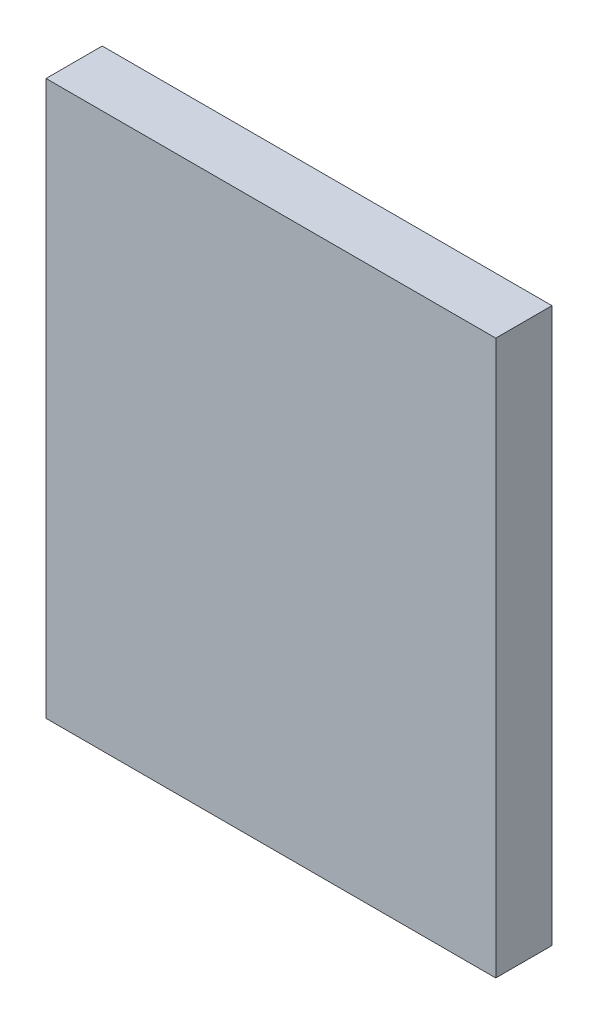
ISO-10303-21;
HEADER;
FILE_DESCRIPTION(('STEP AP214'),'2;1');
FILE_NAME('part.step','',(''),(''),'','','');
FILE_SCHEMA(('AUTOMOTIVE_DESIGN { 1 0 10303 214 1 1 1 1 }'));
ENDSEC;
DATA;
#1=APPLICATION_CONTEXT('core data for automotive mechanical design processes');
#2=APPLICATION_PROTOCOL_DEFINITION('international standard','automotive_design',2000,#1);
#3=PRODUCT_CONTEXT('',#1,'mechanical');
#4=PRODUCT('Part','Part','',(#3));
#5=PRODUCT_RELATED_PRODUCT_CATEGORY('part','',(#4));
#6=PRODUCT_DEFINITION_FORMATION('','',#4);
#7=PRODUCT_DEFINITION_CONTEXT('part definition',#1,'design');
#8=PRODUCT_DEFINITION('design','',#6,#7);
#9=PRODUCT_DEFINITION_SHAPE('','',#8);
#10=(LENGTH_UNIT() NAMED_UNIT(*) SI_UNIT(.MILLI.,.METRE.));
#11=(NAMED_UNIT(*) PLANE_ANGLE_UNIT() SI_UNIT($,.RADIAN.));
#12=(NAMED_UNIT(*) SI_UNIT($,.STERADIAN.) SOLID_ANGLE_UNIT());
#13=UNCERTAINTY_MEASURE_WITH_UNIT(LENGTH_MEASURE(1.E-05),#10,'distance_accuracy_value','');
#14=(GEOMETRIC_REPRESENTATION_CONTEXT(3) GLOBAL_UNCERTAINTY_ASSIGNED_CONTEXT((#13)) GLOBAL_UNIT_ASSIGNED_CONTEXT((#10,
#11,#12)) REPRESENTATION_CONTEXT('',''));
#15=CARTESIAN_POINT('',(0.,0.,0.));
#16=DIRECTION('',(0.,0.,1.));
#17=DIRECTION('',(1.,0.,0.));
#18=AXIS2_PLACEMENT_3D('',#15,#16,#17);
#19=CARTESIAN_POINT('',(7.93749999999919,-54.8106496320324,3.175));
#20=DIRECTION('',(1.09738333905494E-12,1.,0.));
#21=DIRECTION('',(-1.,1.09738333905494E-12,0.));
#22=AXIS2_PLACEMENT_3D('',#19,#20,#21);
#23=PLANE('',#22);
#24=DIRECTION('',(1.,-1.09738333905494E-12,0.));
#25=VECTOR('',#24,1.);
#26=CARTESIAN_POINT('',(7.93749999999919,-54.8106496320324,0.));
#27=LINE('',#26,#25);
#28=CARTESIAN_POINT('',(-17.4625000000007,-54.8106496320045,0.));
#29=VERTEX_POINT('',#28);
#30=CARTESIAN_POINT('',(7.93749999999919,-54.8106496320324,0.));
#31=VERTEX_POINT('',#30);
#32=EDGE_CURVE('E102',#29,#31,#27,.T.);
#33=ORIENTED_EDGE('',*,*,#32,.T.);
#34=DIRECTION('',(0.,0.,-1.));
#35=VECTOR('',#34,1.);
#36=CARTESIAN_POINT('',(7.93749999999919,-54.8106496320324,3.175));
#37=LINE('',#36,#35);
#38=CARTESIAN_POINT('',(7.93749999999919,-54.8106496320324,3.175));
#39=VERTEX_POINT('',#38);
#40=EDGE_CURVE('E11',#39,#31,#37,.T.);
#41=ORIENTED_EDGE('',*,*,#40,.F.);
#42=DIRECTION('',(1.,-1.09738333905494E-12,0.));
#43=VECTOR('',#42,1.);
#44=CARTESIAN_POINT('',(7.93749999999919,-54.8106496320324,3.175));
#45=LINE('',#44,#43);
#46=CARTESIAN_POINT('',(-17.4625000000007,-54.8106496320045,3.175));
#47=VERTEX_POINT('',#46);
#48=EDGE_CURVE('E90',#47,#39,#45,.T.);
#49=ORIENTED_EDGE('',*,*,#48,.F.);
#50=DIRECTION('',(0.,0.,-1.));
#51=VECTOR('',#50,1.);
#52=CARTESIAN_POINT('',(-17.4625000000007,-54.8106496320045,3.175));
#53=LINE('',#52,#51);
#54=EDGE_CURVE('E98',#47,#29,#53,.T.);
#55=ORIENTED_EDGE('',*,*,#54,.T.);
#56=EDGE_LOOP('',(#33,#41,#49,#55));
#57=FACE_BOUND('',#56,.T.);
#58=ADVANCED_FACE('F39',(#57),#23,.F.);
#59=CARTESIAN_POINT('',(7.93749999999919,-23.5124221673556,3.175));
#60=DIRECTION('',(-1.,0.,0.));
#61=DIRECTION('',(0.,0.,1.));
#62=AXIS2_PLACEMENT_3D('',#59,#60,#61);
#63=PLANE('',#62);
#64=DIRECTION('',(0.,1.,0.));
#65=VECTOR('',#64,1.);
#66=CARTESIAN_POINT('',(7.93749999999919,-23.5124221673556,0.));
#67=LINE('',#66,#65);
#68=CARTESIAN_POINT('',(7.93749999999919,-23.5124221673556,0.));
#69=VERTEX_POINT('',#68);
#70=EDGE_CURVE('E94',#31,#69,#67,.T.);
#71=ORIENTED_EDGE('',*,*,#70,.T.);
#72=DIRECTION('',(0.,0.,-1.));
#73=VECTOR('',#72,1.);
#74=CARTESIAN_POINT('',(7.93749999999919,-23.5124221673556,3.175));
#75=LINE('',#74,#73);
#76=CARTESIAN_POINT('',(7.93749999999919,-23.5124221673556,3.175));
#77=VERTEX_POINT('',#76);
#78=EDGE_CURVE('E47',#77,#69,#75,.T.);
#79=ORIENTED_EDGE('',*,*,#78,.F.);
#80=DIRECTION('',(0.,1.,0.));
#81=VECTOR('',#80,1.);
#82=CARTESIAN_POINT('',(7.93749999999919,-23.5124221673556,3.175));
#83=LINE('',#82,#81);
#84=EDGE_CURVE('E85',#39,#77,#83,.T.);
#85=ORIENTED_EDGE('',*,*,#84,.F.);
#86=ORIENTED_EDGE('',*,*,#40,.T.);
#87=EDGE_LOOP('',(#71,#79,#85,#86));
#88=FACE_BOUND('',#87,.T.);
#89=ADVANCED_FACE('F93',(#88),#63,.F.);
#90=CARTESIAN_POINT('',(7.93749999999919,-23.5124221673556,3.175));
#91=DIRECTION('',(0.,-1.,0.));
#92=DIRECTION('',(0.,0.,-1.));
#93=AXIS2_PLACEMENT_3D('',#90,#91,#92);
#94=PLANE('',#93);
#95=DIRECTION('',(-1.,0.,0.));
#96=VECTOR('',#95,1.);
#97=CARTESIAN_POINT('',(7.93749999999919,-23.5124221673556,0.));
#98=LINE('',#97,#96);
#99=CARTESIAN_POINT('',(-17.4625000000007,-23.5124221673556,0.));
#100=VERTEX_POINT('',#99);
#101=EDGE_CURVE('E72',#69,#100,#98,.T.);
#102=ORIENTED_EDGE('',*,*,#101,.T.);
#103=DIRECTION('',(0.,0.,-1.));
#104=VECTOR('',#103,1.);
#105=CARTESIAN_POINT('',(-17.4625000000007,-23.5124221673556,3.175));
#106=LINE('',#105,#104);
#107=CARTESIAN_POINT('',(-17.4625000000007,-23.5124221673556,3.175));
#108=VERTEX_POINT('',#107);
#109=EDGE_CURVE('E95',#108,#100,#106,.T.);
#110=ORIENTED_EDGE('',*,*,#109,.F.);
#111=DIRECTION('',(-1.,0.,0.));
#112=VECTOR('',#111,1.);
#113=CARTESIAN_POINT('',(7.93749999999919,-23.5124221673556,3.175));
#114=LINE('',#113,#112);
#115=EDGE_CURVE('E88',#77,#108,#114,.T.);
#116=ORIENTED_EDGE('',*,*,#115,.F.);
#117=ORIENTED_EDGE('',*,*,#78,.T.);
#118=EDGE_LOOP('',(#102,#110,#116,#117));
#119=FACE_BOUND('',#118,.T.);
#120=ADVANCED_FACE('F96',(#119),#94,.F.);
#121=CARTESIAN_POINT('',(-17.4625000000007,-23.5124221673556,3.175));
#122=DIRECTION('',(1.,0.,0.));
#123=DIRECTION('',(0.,0.,-1.));
#124=AXIS2_PLACEMENT_3D('',#121,#122,#123);
#125=PLANE('',#124);
#126=DIRECTION('',(0.,-1.,0.));
#127=VECTOR('',#126,1.);
#128=CARTESIAN_POINT('',(-17.4625000000007,-23.5124221673556,0.));
#129=LINE('',#128,#127);
#130=EDGE_CURVE('E78',#100,#29,#129,.T.);
#131=ORIENTED_EDGE('',*,*,#130,.T.);
#132=ORIENTED_EDGE('',*,*,#54,.F.);
#133=DIRECTION('',(0.,-1.,0.));
#134=VECTOR('',#133,1.);
#135=CARTESIAN_POINT('',(-17.4625000000007,-23.5124221673556,3.175));
#136=LINE('',#135,#134);
#137=EDGE_CURVE('E55',#108,#47,#136,.T.);
#138=ORIENTED_EDGE('',*,*,#137,.F.);
#139=ORIENTED_EDGE('',*,*,#109,.T.);
#140=EDGE_LOOP('',(#131,#132,#138,#139));
#141=FACE_BOUND('',#140,.T.);
#142=ADVANCED_FACE('F109',(#141),#125,.F.);
#143=CARTESIAN_POINT('',(0.,0.,3.175));
#144=DIRECTION('',(0.,0.,1.));
#145=DIRECTION('',(1.,0.,0.));
#146=AXIS2_PLACEMENT_3D('',#143,#144,#145);
#147=PLANE('',#146);
#148=ORIENTED_EDGE('',*,*,#48,.T.);
#149=ORIENTED_EDGE('',*,*,#84,.T.);
#150=ORIENTED_EDGE('',*,*,#115,.T.);
#151=ORIENTED_EDGE('',*,*,#137,.T.);
#152=EDGE_LOOP('',(#148,#149,#150,#151));
#153=FACE_BOUND('',#152,.T.);
#154=ADVANCED_FACE('F86',(#153),#147,.T.);
#155=CARTESIAN_POINT('',(0.,0.,0.));
#156=DIRECTION('',(0.,0.,1.));
#157=DIRECTION('',(1.,0.,0.));
#158=AXIS2_PLACEMENT_3D('',#155,#156,#157);
#159=PLANE('',#158);
#160=ORIENTED_EDGE('',*,*,#32,.F.);
#161=ORIENTED_EDGE('',*,*,#130,.F.);
#162=ORIENTED_EDGE('',*,*,#101,.F.);
#163=ORIENTED_EDGE('',*,*,#70,.F.);
#164=EDGE_LOOP('',(#160,#161,#162,#163));
#165=FACE_BOUND('',#164,.T.);
#166=ADVANCED_FACE('F112',(#165),#159,.F.);
#167=CLOSED_SHELL('',(#58,#89,#120,#142,#154,#166));
#168=MANIFOLD_SOLID_BREP('B2',#167);
#169=ADVANCED_BREP_SHAPE_REPRESENTATION('',(#18,#168),#14);
#170=SHAPE_DEFINITION_REPRESENTATION(#9,#169);
ENDSEC;
END-ISO-10303-21;
